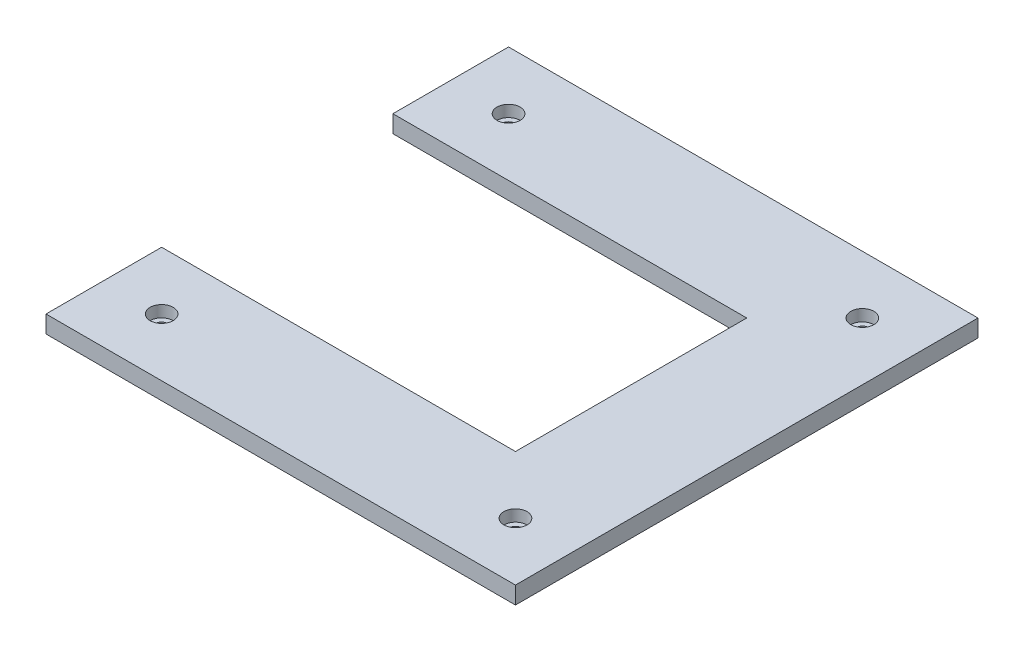
ISO-10303-21;
HEADER;
FILE_DESCRIPTION(('STEP AP214'),'2;1');
FILE_NAME('part.step','',(''),(''),'','','');
FILE_SCHEMA(('AUTOMOTIVE_DESIGN { 1 0 10303 214 1 1 1 1 }'));
ENDSEC;
DATA;
#1=APPLICATION_CONTEXT('core data for automotive mechanical design processes');
#2=APPLICATION_PROTOCOL_DEFINITION('international standard','automotive_design',2000,#1);
#3=PRODUCT_CONTEXT('',#1,'mechanical');
#4=PRODUCT('Part','Part','',(#3));
#5=PRODUCT_RELATED_PRODUCT_CATEGORY('part','',(#4));
#6=PRODUCT_DEFINITION_FORMATION('','',#4);
#7=PRODUCT_DEFINITION_CONTEXT('part definition',#1,'design');
#8=PRODUCT_DEFINITION('design','',#6,#7);
#9=PRODUCT_DEFINITION_SHAPE('','',#8);
#10=(LENGTH_UNIT() NAMED_UNIT(*) SI_UNIT(.MILLI.,.METRE.));
#11=(NAMED_UNIT(*) PLANE_ANGLE_UNIT() SI_UNIT($,.RADIAN.));
#12=(NAMED_UNIT(*) SI_UNIT($,.STERADIAN.) SOLID_ANGLE_UNIT());
#13=UNCERTAINTY_MEASURE_WITH_UNIT(LENGTH_MEASURE(1.E-05),#10,'distance_accuracy_value','');
#14=(GEOMETRIC_REPRESENTATION_CONTEXT(3) GLOBAL_UNCERTAINTY_ASSIGNED_CONTEXT((#13)) GLOBAL_UNIT_ASSIGNED_CONTEXT((#10,
#11,#12)) REPRESENTATION_CONTEXT('',''));
#15=CARTESIAN_POINT('',(0.,0.,0.));
#16=DIRECTION('',(0.,0.,1.));
#17=DIRECTION('',(1.,0.,0.));
#18=AXIS2_PLACEMENT_3D('',#15,#16,#17);
#19=CARTESIAN_POINT('',(0.,6.,0.));
#20=DIRECTION('',(0.,-1.,0.));
#21=DIRECTION('',(-1.,0.,0.));
#22=AXIS2_PLACEMENT_3D('',#19,#20,#21);
#23=PLANE('',#22);
#24=CARTESIAN_POINT('',(-142.4,6.,60.));
#25=DIRECTION('',(0.,1.,0.));
#26=DIRECTION('',(0.,0.,1.));
#27=AXIS2_PLACEMENT_3D('',#24,#25,#26);
#28=CIRCLE('',#27,4.);
#29=CARTESIAN_POINT('',(-142.4,6.,64.));
#30=VERTEX_POINT('',#29);
#31=EDGE_CURVE('E258',#30,#30,#28,.T.);
#32=ORIENTED_EDGE('',*,*,#31,.F.);
#33=EDGE_LOOP('',(#32));
#34=FACE_BOUND('',#33,.T.);
#35=CARTESIAN_POINT('',(-20.,6.,-60.));
#36=DIRECTION('',(0.,1.,0.));
#37=DIRECTION('',(0.,0.,1.));
#38=AXIS2_PLACEMENT_3D('',#35,#36,#37);
#39=CIRCLE('',#38,3.99999999999999);
#40=CARTESIAN_POINT('',(-20.,6.,-56.));
#41=VERTEX_POINT('',#40);
#42=EDGE_CURVE('E242',#41,#41,#39,.T.);
#43=ORIENTED_EDGE('',*,*,#42,.F.);
#44=EDGE_LOOP('',(#43));
#45=FACE_BOUND('',#44,.T.);
#46=DIRECTION('',(-1.,0.,0.));
#47=VECTOR('',#46,1.);
#48=CARTESIAN_POINT('',(0.,6.,40.));
#49=LINE('',#48,#47);
#50=CARTESIAN_POINT('',(-40.,6.,40.));
#51=VERTEX_POINT('',#50);
#52=CARTESIAN_POINT('',(-162.4,6.,40.));
#53=VERTEX_POINT('',#52);
#54=EDGE_CURVE('E102',#51,#53,#49,.T.);
#55=ORIENTED_EDGE('',*,*,#54,.T.);
#56=DIRECTION('',(0.,0.,-1.));
#57=VECTOR('',#56,1.);
#58=CARTESIAN_POINT('',(-162.4,6.,80.));
#59=LINE('',#58,#57);
#60=CARTESIAN_POINT('',(-162.4,6.,80.));
#61=VERTEX_POINT('',#60);
#62=EDGE_CURVE('E206',#61,#53,#59,.T.);
#63=ORIENTED_EDGE('',*,*,#62,.F.);
#64=DIRECTION('',(-1.,0.,0.));
#65=VECTOR('',#64,1.);
#66=CARTESIAN_POINT('',(0.,6.,80.));
#67=LINE('',#66,#65);
#68=CARTESIAN_POINT('',(0.,6.,80.));
#69=VERTEX_POINT('',#68);
#70=EDGE_CURVE('E194',#69,#61,#67,.T.);
#71=ORIENTED_EDGE('',*,*,#70,.F.);
#72=DIRECTION('',(0.,0.,1.));
#73=VECTOR('',#72,1.);
#74=CARTESIAN_POINT('',(0.,6.,-80.));
#75=LINE('',#74,#73);
#76=CARTESIAN_POINT('',(0.,6.,-80.));
#77=VERTEX_POINT('',#76);
#78=EDGE_CURVE('E142',#77,#69,#75,.T.);
#79=ORIENTED_EDGE('',*,*,#78,.F.);
#80=DIRECTION('',(1.,0.,0.));
#81=VECTOR('',#80,1.);
#82=CARTESIAN_POINT('',(0.,6.,-80.));
#83=LINE('',#82,#81);
#84=CARTESIAN_POINT('',(-162.4,6.,-80.));
#85=VERTEX_POINT('',#84);
#86=EDGE_CURVE('E138',#85,#77,#83,.T.);
#87=ORIENTED_EDGE('',*,*,#86,.F.);
#88=DIRECTION('',(0.,0.,-1.));
#89=VECTOR('',#88,1.);
#90=CARTESIAN_POINT('',(-162.4,6.,-40.));
#91=LINE('',#90,#89);
#92=CARTESIAN_POINT('',(-162.4,6.,-40.));
#93=VERTEX_POINT('',#92);
#94=EDGE_CURVE('E123',#93,#85,#91,.T.);
#95=ORIENTED_EDGE('',*,*,#94,.F.);
#96=DIRECTION('',(1.,0.,0.));
#97=VECTOR('',#96,1.);
#98=CARTESIAN_POINT('',(0.,6.,-40.));
#99=LINE('',#98,#97);
#100=CARTESIAN_POINT('',(-40.,6.,-40.));
#101=VERTEX_POINT('',#100);
#102=EDGE_CURVE('E130',#93,#101,#99,.T.);
#103=ORIENTED_EDGE('',*,*,#102,.T.);
#104=DIRECTION('',(0.,0.,1.));
#105=VECTOR('',#104,1.);
#106=CARTESIAN_POINT('',(-40.,6.,-80.));
#107=LINE('',#106,#105);
#108=EDGE_CURVE('E63',#101,#51,#107,.T.);
#109=ORIENTED_EDGE('',*,*,#108,.T.);
#110=EDGE_LOOP('',(#55,#63,#71,#79,#87,#95,#103,#109));
#111=FACE_BOUND('',#110,.T.);
#112=CARTESIAN_POINT('',(-20.,6.,60.));
#113=DIRECTION('',(0.,1.,0.));
#114=DIRECTION('',(0.,0.,1.));
#115=AXIS2_PLACEMENT_3D('',#112,#113,#114);
#116=CIRCLE('',#115,3.99999999999999);
#117=CARTESIAN_POINT('',(-20.,6.,64.));
#118=VERTEX_POINT('',#117);
#119=EDGE_CURVE('E226',#118,#118,#116,.T.);
#120=ORIENTED_EDGE('',*,*,#119,.F.);
#121=EDGE_LOOP('',(#120));
#122=FACE_BOUND('',#121,.T.);
#123=CARTESIAN_POINT('',(-142.4,6.,-60.));
#124=DIRECTION('',(0.,1.,0.));
#125=DIRECTION('',(0.,0.,1.));
#126=AXIS2_PLACEMENT_3D('',#123,#124,#125);
#127=CIRCLE('',#126,4.);
#128=CARTESIAN_POINT('',(-142.4,6.,-56.));
#129=VERTEX_POINT('',#128);
#130=EDGE_CURVE('E274',#129,#129,#127,.T.);
#131=ORIENTED_EDGE('',*,*,#130,.F.);
#132=EDGE_LOOP('',(#131));
#133=FACE_BOUND('',#132,.T.);
#134=ADVANCED_FACE('F45',(#34,#45,#111,#122,#133),#23,.F.);
#135=CARTESIAN_POINT('',(0.,6.,40.));
#136=DIRECTION('',(0.,0.,1.));
#137=DIRECTION('',(1.,0.,0.));
#138=AXIS2_PLACEMENT_3D('',#135,#136,#137);
#139=PLANE('',#138);
#140=DIRECTION('',(-1.,0.,0.));
#141=VECTOR('',#140,1.);
#142=CARTESIAN_POINT('',(0.,0.,40.));
#143=LINE('',#142,#141);
#144=CARTESIAN_POINT('',(-40.,0.,40.));
#145=VERTEX_POINT('',#144);
#146=CARTESIAN_POINT('',(-162.4,0.,40.));
#147=VERTEX_POINT('',#146);
#148=EDGE_CURVE('E149',#145,#147,#143,.T.);
#149=ORIENTED_EDGE('',*,*,#148,.T.);
#150=DIRECTION('',(0.,-1.,0.));
#151=VECTOR('',#150,1.);
#152=CARTESIAN_POINT('',(-162.4,6.,40.));
#153=LINE('',#152,#151);
#154=EDGE_CURVE('E11',#53,#147,#153,.T.);
#155=ORIENTED_EDGE('',*,*,#154,.F.);
#156=ORIENTED_EDGE('',*,*,#54,.F.);
#157=DIRECTION('',(0.,-1.,0.));
#158=VECTOR('',#157,1.);
#159=CARTESIAN_POINT('',(-40.,6.,40.));
#160=LINE('',#159,#158);
#161=EDGE_CURVE('E148',#51,#145,#160,.T.);
#162=ORIENTED_EDGE('',*,*,#161,.T.);
#163=EDGE_LOOP('',(#149,#155,#156,#162));
#164=FACE_BOUND('',#163,.T.);
#165=ADVANCED_FACE('F47',(#164),#139,.F.);
#166=CARTESIAN_POINT('',(-162.4,6.,80.));
#167=DIRECTION('',(-1.,0.,0.));
#168=DIRECTION('',(0.,0.,1.));
#169=AXIS2_PLACEMENT_3D('',#166,#167,#168);
#170=PLANE('',#169);
#171=DIRECTION('',(0.,0.,-1.));
#172=VECTOR('',#171,1.);
#173=CARTESIAN_POINT('',(-162.4,0.,80.));
#174=LINE('',#173,#172);
#175=CARTESIAN_POINT('',(-162.4,0.,80.));
#176=VERTEX_POINT('',#175);
#177=EDGE_CURVE('E153',#176,#147,#174,.T.);
#178=ORIENTED_EDGE('',*,*,#177,.F.);
#179=DIRECTION('',(0.,-1.,0.));
#180=VECTOR('',#179,1.);
#181=CARTESIAN_POINT('',(-162.4,6.,80.));
#182=LINE('',#181,#180);
#183=EDGE_CURVE('E55',#61,#176,#182,.T.);
#184=ORIENTED_EDGE('',*,*,#183,.F.);
#185=ORIENTED_EDGE('',*,*,#62,.T.);
#186=ORIENTED_EDGE('',*,*,#154,.T.);
#187=EDGE_LOOP('',(#178,#184,#185,#186));
#188=FACE_BOUND('',#187,.T.);
#189=ADVANCED_FACE('F197',(#188),#170,.T.);
#190=CARTESIAN_POINT('',(0.,6.,80.));
#191=DIRECTION('',(0.,0.,1.));
#192=DIRECTION('',(1.,0.,0.));
#193=AXIS2_PLACEMENT_3D('',#190,#191,#192);
#194=PLANE('',#193);
#195=DIRECTION('',(-1.,0.,0.));
#196=VECTOR('',#195,1.);
#197=CARTESIAN_POINT('',(0.,0.,80.));
#198=LINE('',#197,#196);
#199=CARTESIAN_POINT('',(0.,0.,80.));
#200=VERTEX_POINT('',#199);
#201=EDGE_CURVE('E158',#200,#176,#198,.T.);
#202=ORIENTED_EDGE('',*,*,#201,.F.);
#203=DIRECTION('',(0.,-1.,0.));
#204=VECTOR('',#203,1.);
#205=CARTESIAN_POINT('',(0.,6.,80.));
#206=LINE('',#205,#204);
#207=EDGE_CURVE('E185',#69,#200,#206,.T.);
#208=ORIENTED_EDGE('',*,*,#207,.F.);
#209=ORIENTED_EDGE('',*,*,#70,.T.);
#210=ORIENTED_EDGE('',*,*,#183,.T.);
#211=EDGE_LOOP('',(#202,#208,#209,#210));
#212=FACE_BOUND('',#211,.T.);
#213=ADVANCED_FACE('F192',(#212),#194,.T.);
#214=CARTESIAN_POINT('',(0.,6.,-80.));
#215=DIRECTION('',(1.,0.,0.));
#216=DIRECTION('',(0.,0.,-1.));
#217=AXIS2_PLACEMENT_3D('',#214,#215,#216);
#218=PLANE('',#217);
#219=DIRECTION('',(0.,0.,1.));
#220=VECTOR('',#219,1.);
#221=CARTESIAN_POINT('',(0.,0.,-80.));
#222=LINE('',#221,#220);
#223=CARTESIAN_POINT('',(0.,0.,-80.));
#224=VERTEX_POINT('',#223);
#225=EDGE_CURVE('E162',#224,#200,#222,.T.);
#226=ORIENTED_EDGE('',*,*,#225,.F.);
#227=DIRECTION('',(0.,-1.,0.));
#228=VECTOR('',#227,1.);
#229=CARTESIAN_POINT('',(0.,6.,-80.));
#230=LINE('',#229,#228);
#231=EDGE_CURVE('E182',#77,#224,#230,.T.);
#232=ORIENTED_EDGE('',*,*,#231,.F.);
#233=ORIENTED_EDGE('',*,*,#78,.T.);
#234=ORIENTED_EDGE('',*,*,#207,.T.);
#235=EDGE_LOOP('',(#226,#232,#233,#234));
#236=FACE_BOUND('',#235,.T.);
#237=ADVANCED_FACE('F204',(#236),#218,.T.);
#238=CARTESIAN_POINT('',(0.,6.,-80.));
#239=DIRECTION('',(0.,0.,-1.));
#240=DIRECTION('',(-1.,0.,0.));
#241=AXIS2_PLACEMENT_3D('',#238,#239,#240);
#242=PLANE('',#241);
#243=DIRECTION('',(1.,0.,0.));
#244=VECTOR('',#243,1.);
#245=CARTESIAN_POINT('',(0.,0.,-80.));
#246=LINE('',#245,#244);
#247=CARTESIAN_POINT('',(-162.4,0.,-80.));
#248=VERTEX_POINT('',#247);
#249=EDGE_CURVE('E166',#248,#224,#246,.T.);
#250=ORIENTED_EDGE('',*,*,#249,.F.);
#251=DIRECTION('',(0.,-1.,0.));
#252=VECTOR('',#251,1.);
#253=CARTESIAN_POINT('',(-162.4,6.,-80.));
#254=LINE('',#253,#252);
#255=EDGE_CURVE('E127',#85,#248,#254,.T.);
#256=ORIENTED_EDGE('',*,*,#255,.F.);
#257=ORIENTED_EDGE('',*,*,#86,.T.);
#258=ORIENTED_EDGE('',*,*,#231,.T.);
#259=EDGE_LOOP('',(#250,#256,#257,#258));
#260=FACE_BOUND('',#259,.T.);
#261=ADVANCED_FACE('F304',(#260),#242,.T.);
#262=CARTESIAN_POINT('',(-162.4,6.,-40.));
#263=DIRECTION('',(-1.,0.,0.));
#264=DIRECTION('',(0.,0.,1.));
#265=AXIS2_PLACEMENT_3D('',#262,#263,#264);
#266=PLANE('',#265);
#267=DIRECTION('',(0.,0.,-1.));
#268=VECTOR('',#267,1.);
#269=CARTESIAN_POINT('',(-162.4,0.,-40.));
#270=LINE('',#269,#268);
#271=CARTESIAN_POINT('',(-162.4,0.,-40.));
#272=VERTEX_POINT('',#271);
#273=EDGE_CURVE('E125',#272,#248,#270,.T.);
#274=ORIENTED_EDGE('',*,*,#273,.F.);
#275=DIRECTION('',(0.,-1.,0.));
#276=VECTOR('',#275,1.);
#277=CARTESIAN_POINT('',(-162.4,6.,-40.));
#278=LINE('',#277,#276);
#279=EDGE_CURVE('E119',#93,#272,#278,.T.);
#280=ORIENTED_EDGE('',*,*,#279,.F.);
#281=ORIENTED_EDGE('',*,*,#94,.T.);
#282=ORIENTED_EDGE('',*,*,#255,.T.);
#283=EDGE_LOOP('',(#274,#280,#281,#282));
#284=FACE_BOUND('',#283,.T.);
#285=ADVANCED_FACE('F121',(#284),#266,.T.);
#286=CARTESIAN_POINT('',(0.,6.,-40.));
#287=DIRECTION('',(0.,0.,-1.));
#288=DIRECTION('',(-1.,0.,0.));
#289=AXIS2_PLACEMENT_3D('',#286,#287,#288);
#290=PLANE('',#289);
#291=DIRECTION('',(1.,0.,0.));
#292=VECTOR('',#291,1.);
#293=CARTESIAN_POINT('',(0.,0.,-40.));
#294=LINE('',#293,#292);
#295=CARTESIAN_POINT('',(-40.,0.,-40.));
#296=VERTEX_POINT('',#295);
#297=EDGE_CURVE('E90',#272,#296,#294,.T.);
#298=ORIENTED_EDGE('',*,*,#297,.T.);
#299=DIRECTION('',(0.,-1.,0.));
#300=VECTOR('',#299,1.);
#301=CARTESIAN_POINT('',(-40.,6.,-40.));
#302=LINE('',#301,#300);
#303=EDGE_CURVE('E128',#101,#296,#302,.T.);
#304=ORIENTED_EDGE('',*,*,#303,.F.);
#305=ORIENTED_EDGE('',*,*,#102,.F.);
#306=ORIENTED_EDGE('',*,*,#279,.T.);
#307=EDGE_LOOP('',(#298,#304,#305,#306));
#308=FACE_BOUND('',#307,.T.);
#309=ADVANCED_FACE('F131',(#308),#290,.F.);
#310=CARTESIAN_POINT('',(-40.,6.,-80.));
#311=DIRECTION('',(1.,0.,0.));
#312=DIRECTION('',(0.,0.,-1.));
#313=AXIS2_PLACEMENT_3D('',#310,#311,#312);
#314=PLANE('',#313);
#315=DIRECTION('',(0.,0.,1.));
#316=VECTOR('',#315,1.);
#317=CARTESIAN_POINT('',(-40.,0.,-80.));
#318=LINE('',#317,#316);
#319=EDGE_CURVE('E96',#296,#145,#318,.T.);
#320=ORIENTED_EDGE('',*,*,#319,.T.);
#321=ORIENTED_EDGE('',*,*,#161,.F.);
#322=ORIENTED_EDGE('',*,*,#108,.F.);
#323=ORIENTED_EDGE('',*,*,#303,.T.);
#324=EDGE_LOOP('',(#320,#321,#322,#323));
#325=FACE_BOUND('',#324,.T.);
#326=ADVANCED_FACE('F297',(#325),#314,.F.);
#327=CARTESIAN_POINT('',(0.,0.,0.));
#328=DIRECTION('',(0.,-1.,0.));
#329=DIRECTION('',(-1.,0.,0.));
#330=AXIS2_PLACEMENT_3D('',#327,#328,#329);
#331=PLANE('',#330);
#332=CARTESIAN_POINT('',(-142.4,0.,-60.));
#333=DIRECTION('',(0.,-1.,0.));
#334=DIRECTION('',(0.,0.,-1.));
#335=AXIS2_PLACEMENT_3D('',#332,#333,#334);
#336=CIRCLE('',#335,2.25);
#337=CARTESIAN_POINT('',(-142.4,0.,-62.25));
#338=VERTEX_POINT('',#337);
#339=EDGE_CURVE('E262',#338,#338,#336,.T.);
#340=ORIENTED_EDGE('',*,*,#339,.F.);
#341=EDGE_LOOP('',(#340));
#342=FACE_BOUND('',#341,.T.);
#343=CARTESIAN_POINT('',(-142.4,0.,60.));
#344=DIRECTION('',(0.,-1.,0.));
#345=DIRECTION('',(0.,0.,-1.));
#346=AXIS2_PLACEMENT_3D('',#343,#344,#345);
#347=CIRCLE('',#346,2.25);
#348=CARTESIAN_POINT('',(-142.4,0.,57.75));
#349=VERTEX_POINT('',#348);
#350=EDGE_CURVE('E246',#349,#349,#347,.T.);
#351=ORIENTED_EDGE('',*,*,#350,.F.);
#352=EDGE_LOOP('',(#351));
#353=FACE_BOUND('',#352,.T.);
#354=CARTESIAN_POINT('',(-20.,0.,-60.));
#355=DIRECTION('',(0.,-1.,0.));
#356=DIRECTION('',(0.,0.,-1.));
#357=AXIS2_PLACEMENT_3D('',#354,#355,#356);
#358=CIRCLE('',#357,2.25000000000001);
#359=CARTESIAN_POINT('',(-20.,0.,-62.25));
#360=VERTEX_POINT('',#359);
#361=EDGE_CURVE('E230',#360,#360,#358,.T.);
#362=ORIENTED_EDGE('',*,*,#361,.F.);
#363=EDGE_LOOP('',(#362));
#364=FACE_BOUND('',#363,.T.);
#365=CARTESIAN_POINT('',(-20.,0.,60.));
#366=DIRECTION('',(0.,-1.,0.));
#367=DIRECTION('',(0.,0.,-1.));
#368=AXIS2_PLACEMENT_3D('',#365,#366,#367);
#369=CIRCLE('',#368,2.25000000000001);
#370=CARTESIAN_POINT('',(-20.,0.,57.75));
#371=VERTEX_POINT('',#370);
#372=EDGE_CURVE('E154',#371,#371,#369,.T.);
#373=ORIENTED_EDGE('',*,*,#372,.F.);
#374=EDGE_LOOP('',(#373));
#375=FACE_BOUND('',#374,.T.);
#376=ORIENTED_EDGE('',*,*,#148,.F.);
#377=ORIENTED_EDGE('',*,*,#319,.F.);
#378=ORIENTED_EDGE('',*,*,#297,.F.);
#379=ORIENTED_EDGE('',*,*,#273,.T.);
#380=ORIENTED_EDGE('',*,*,#249,.T.);
#381=ORIENTED_EDGE('',*,*,#225,.T.);
#382=ORIENTED_EDGE('',*,*,#201,.T.);
#383=ORIENTED_EDGE('',*,*,#177,.T.);
#384=EDGE_LOOP('',(#376,#377,#378,#379,#380,#381,#382,#383));
#385=FACE_BOUND('',#384,.T.);
#386=ADVANCED_FACE('F200',(#342,#353,#364,#375,#385),#331,.T.);
#387=CARTESIAN_POINT('',(-20.,6.,60.));
#388=DIRECTION('',(0.,1.,0.));
#389=DIRECTION('',(0.,0.,1.));
#390=AXIS2_PLACEMENT_3D('',#387,#388,#389);
#391=CYLINDRICAL_SURFACE('',#390,2.25000000000001);
#392=CARTESIAN_POINT('',(-20.,2.,60.));
#393=DIRECTION('',(0.,1.,0.));
#394=DIRECTION('',(0.,0.,1.));
#395=AXIS2_PLACEMENT_3D('',#392,#393,#394);
#396=CIRCLE('',#395,2.25000000000001);
#397=CARTESIAN_POINT('',(-20.,2.,62.25));
#398=VERTEX_POINT('',#397);
#399=EDGE_CURVE('E218',#398,#398,#396,.T.);
#400=ORIENTED_EDGE('',*,*,#399,.T.);
#401=EDGE_LOOP('',(#400));
#402=FACE_BOUND('',#401,.T.);
#403=ORIENTED_EDGE('',*,*,#372,.T.);
#404=EDGE_LOOP('',(#403));
#405=FACE_BOUND('',#404,.T.);
#406=ADVANCED_FACE('F294',(#402,#405),#391,.F.);
#407=CARTESIAN_POINT('',(-17.75,2.,60.));
#408=DIRECTION('',(0.,-1.,0.));
#409=DIRECTION('',(0.,0.,-1.));
#410=AXIS2_PLACEMENT_3D('',#407,#408,#409);
#411=PLANE('',#410);
#412=ORIENTED_EDGE('',*,*,#399,.F.);
#413=EDGE_LOOP('',(#412));
#414=FACE_BOUND('',#413,.T.);
#415=CARTESIAN_POINT('',(-20.,2.,60.));
#416=DIRECTION('',(0.,1.,0.));
#417=DIRECTION('',(0.,0.,1.));
#418=AXIS2_PLACEMENT_3D('',#415,#416,#417);
#419=CIRCLE('',#418,3.99999999999999);
#420=CARTESIAN_POINT('',(-20.,2.,64.));
#421=VERTEX_POINT('',#420);
#422=EDGE_CURVE('E222',#421,#421,#419,.T.);
#423=ORIENTED_EDGE('',*,*,#422,.T.);
#424=EDGE_LOOP('',(#423));
#425=FACE_BOUND('',#424,.T.);
#426=ADVANCED_FACE('F366',(#414,#425),#411,.F.);
#427=CARTESIAN_POINT('',(-20.,6.,60.));
#428=DIRECTION('',(0.,1.,0.));
#429=DIRECTION('',(0.,0.,1.));
#430=AXIS2_PLACEMENT_3D('',#427,#428,#429);
#431=CYLINDRICAL_SURFACE('',#430,3.99999999999999);
#432=ORIENTED_EDGE('',*,*,#422,.F.);
#433=EDGE_LOOP('',(#432));
#434=FACE_BOUND('',#433,.T.);
#435=ORIENTED_EDGE('',*,*,#119,.T.);
#436=EDGE_LOOP('',(#435));
#437=FACE_BOUND('',#436,.T.);
#438=ADVANCED_FACE('F375',(#434,#437),#431,.F.);
#439=CARTESIAN_POINT('',(-20.,6.,-60.));
#440=DIRECTION('',(0.,1.,0.));
#441=DIRECTION('',(0.,0.,1.));
#442=AXIS2_PLACEMENT_3D('',#439,#440,#441);
#443=CYLINDRICAL_SURFACE('',#442,2.25000000000001);
#444=CARTESIAN_POINT('',(-20.,2.,-60.));
#445=DIRECTION('',(0.,1.,0.));
#446=DIRECTION('',(0.,0.,1.));
#447=AXIS2_PLACEMENT_3D('',#444,#445,#446);
#448=CIRCLE('',#447,2.25000000000001);
#449=CARTESIAN_POINT('',(-20.,2.,-57.75));
#450=VERTEX_POINT('',#449);
#451=EDGE_CURVE('E234',#450,#450,#448,.T.);
#452=ORIENTED_EDGE('',*,*,#451,.T.);
#453=EDGE_LOOP('',(#452));
#454=FACE_BOUND('',#453,.T.);
#455=ORIENTED_EDGE('',*,*,#361,.T.);
#456=EDGE_LOOP('',(#455));
#457=FACE_BOUND('',#456,.T.);
#458=ADVANCED_FACE('F384',(#454,#457),#443,.F.);
#459=CARTESIAN_POINT('',(-17.75,2.,-60.));
#460=DIRECTION('',(0.,-1.,0.));
#461=DIRECTION('',(0.,0.,-1.));
#462=AXIS2_PLACEMENT_3D('',#459,#460,#461);
#463=PLANE('',#462);
#464=ORIENTED_EDGE('',*,*,#451,.F.);
#465=EDGE_LOOP('',(#464));
#466=FACE_BOUND('',#465,.T.);
#467=CARTESIAN_POINT('',(-20.,2.,-60.));
#468=DIRECTION('',(0.,1.,0.));
#469=DIRECTION('',(0.,0.,1.));
#470=AXIS2_PLACEMENT_3D('',#467,#468,#469);
#471=CIRCLE('',#470,3.99999999999999);
#472=CARTESIAN_POINT('',(-20.,2.,-56.));
#473=VERTEX_POINT('',#472);
#474=EDGE_CURVE('E238',#473,#473,#471,.T.);
#475=ORIENTED_EDGE('',*,*,#474,.T.);
#476=EDGE_LOOP('',(#475));
#477=FACE_BOUND('',#476,.T.);
#478=ADVANCED_FACE('F394',(#466,#477),#463,.F.);
#479=CARTESIAN_POINT('',(-20.,6.,-60.));
#480=DIRECTION('',(0.,1.,0.));
#481=DIRECTION('',(0.,0.,1.));
#482=AXIS2_PLACEMENT_3D('',#479,#480,#481);
#483=CYLINDRICAL_SURFACE('',#482,3.99999999999999);
#484=ORIENTED_EDGE('',*,*,#474,.F.);
#485=EDGE_LOOP('',(#484));
#486=FACE_BOUND('',#485,.T.);
#487=ORIENTED_EDGE('',*,*,#42,.T.);
#488=EDGE_LOOP('',(#487));
#489=FACE_BOUND('',#488,.T.);
#490=ADVANCED_FACE('F404',(#486,#489),#483,.F.);
#491=CARTESIAN_POINT('',(-142.4,6.,60.));
#492=DIRECTION('',(0.,1.,0.));
#493=DIRECTION('',(0.,0.,1.));
#494=AXIS2_PLACEMENT_3D('',#491,#492,#493);
#495=CYLINDRICAL_SURFACE('',#494,2.25);
#496=CARTESIAN_POINT('',(-142.4,2.,60.));
#497=DIRECTION('',(0.,1.,0.));
#498=DIRECTION('',(0.,0.,1.));
#499=AXIS2_PLACEMENT_3D('',#496,#497,#498);
#500=CIRCLE('',#499,2.25);
#501=CARTESIAN_POINT('',(-142.4,2.,62.25));
#502=VERTEX_POINT('',#501);
#503=EDGE_CURVE('E250',#502,#502,#500,.T.);
#504=ORIENTED_EDGE('',*,*,#503,.T.);
#505=EDGE_LOOP('',(#504));
#506=FACE_BOUND('',#505,.T.);
#507=ORIENTED_EDGE('',*,*,#350,.T.);
#508=EDGE_LOOP('',(#507));
#509=FACE_BOUND('',#508,.T.);
#510=ADVANCED_FACE('F414',(#506,#509),#495,.F.);
#511=CARTESIAN_POINT('',(-140.15,2.,60.));
#512=DIRECTION('',(0.,-1.,0.));
#513=DIRECTION('',(0.,0.,-1.));
#514=AXIS2_PLACEMENT_3D('',#511,#512,#513);
#515=PLANE('',#514);
#516=ORIENTED_EDGE('',*,*,#503,.F.);
#517=EDGE_LOOP('',(#516));
#518=FACE_BOUND('',#517,.T.);
#519=CARTESIAN_POINT('',(-142.4,2.,60.));
#520=DIRECTION('',(0.,1.,0.));
#521=DIRECTION('',(0.,0.,1.));
#522=AXIS2_PLACEMENT_3D('',#519,#520,#521);
#523=CIRCLE('',#522,4.);
#524=CARTESIAN_POINT('',(-142.4,2.,64.));
#525=VERTEX_POINT('',#524);
#526=EDGE_CURVE('E254',#525,#525,#523,.T.);
#527=ORIENTED_EDGE('',*,*,#526,.T.);
#528=EDGE_LOOP('',(#527));
#529=FACE_BOUND('',#528,.T.);
#530=ADVANCED_FACE('F424',(#518,#529),#515,.F.);
#531=CARTESIAN_POINT('',(-142.4,6.,60.));
#532=DIRECTION('',(0.,1.,0.));
#533=DIRECTION('',(0.,0.,1.));
#534=AXIS2_PLACEMENT_3D('',#531,#532,#533);
#535=CYLINDRICAL_SURFACE('',#534,4.);
#536=ORIENTED_EDGE('',*,*,#526,.F.);
#537=EDGE_LOOP('',(#536));
#538=FACE_BOUND('',#537,.T.);
#539=ORIENTED_EDGE('',*,*,#31,.T.);
#540=EDGE_LOOP('',(#539));
#541=FACE_BOUND('',#540,.T.);
#542=ADVANCED_FACE('F434',(#538,#541),#535,.F.);
#543=CARTESIAN_POINT('',(-142.4,6.,-60.));
#544=DIRECTION('',(0.,1.,0.));
#545=DIRECTION('',(0.,0.,1.));
#546=AXIS2_PLACEMENT_3D('',#543,#544,#545);
#547=CYLINDRICAL_SURFACE('',#546,2.25);
#548=CARTESIAN_POINT('',(-142.4,2.,-60.));
#549=DIRECTION('',(0.,1.,0.));
#550=DIRECTION('',(0.,0.,1.));
#551=AXIS2_PLACEMENT_3D('',#548,#549,#550);
#552=CIRCLE('',#551,2.25);
#553=CARTESIAN_POINT('',(-142.4,2.,-57.75));
#554=VERTEX_POINT('',#553);
#555=EDGE_CURVE('E266',#554,#554,#552,.T.);
#556=ORIENTED_EDGE('',*,*,#555,.T.);
#557=EDGE_LOOP('',(#556));
#558=FACE_BOUND('',#557,.T.);
#559=ORIENTED_EDGE('',*,*,#339,.T.);
#560=EDGE_LOOP('',(#559));
#561=FACE_BOUND('',#560,.T.);
#562=ADVANCED_FACE('F444',(#558,#561),#547,.F.);
#563=CARTESIAN_POINT('',(-140.15,2.,-60.));
#564=DIRECTION('',(0.,-1.,0.));
#565=DIRECTION('',(0.,0.,-1.));
#566=AXIS2_PLACEMENT_3D('',#563,#564,#565);
#567=PLANE('',#566);
#568=ORIENTED_EDGE('',*,*,#555,.F.);
#569=EDGE_LOOP('',(#568));
#570=FACE_BOUND('',#569,.T.);
#571=CARTESIAN_POINT('',(-142.4,2.,-60.));
#572=DIRECTION('',(0.,1.,0.));
#573=DIRECTION('',(0.,0.,1.));
#574=AXIS2_PLACEMENT_3D('',#571,#572,#573);
#575=CIRCLE('',#574,4.);
#576=CARTESIAN_POINT('',(-142.4,2.,-56.));
#577=VERTEX_POINT('',#576);
#578=EDGE_CURVE('E270',#577,#577,#575,.T.);
#579=ORIENTED_EDGE('',*,*,#578,.T.);
#580=EDGE_LOOP('',(#579));
#581=FACE_BOUND('',#580,.T.);
#582=ADVANCED_FACE('F454',(#570,#581),#567,.F.);
#583=CARTESIAN_POINT('',(-142.4,6.,-60.));
#584=DIRECTION('',(0.,1.,0.));
#585=DIRECTION('',(0.,0.,1.));
#586=AXIS2_PLACEMENT_3D('',#583,#584,#585);
#587=CYLINDRICAL_SURFACE('',#586,4.);
#588=ORIENTED_EDGE('',*,*,#578,.F.);
#589=EDGE_LOOP('',(#588));
#590=FACE_BOUND('',#589,.T.);
#591=ORIENTED_EDGE('',*,*,#130,.T.);
#592=EDGE_LOOP('',(#591));
#593=FACE_BOUND('',#592,.T.);
#594=ADVANCED_FACE('F279',(#590,#593),#587,.F.);
#595=CLOSED_SHELL('',(#134,#165,#189,#213,#237,#261,#285,#309,#326,#386,#406,#426,#438,#458,
#478,#490,#510,#530,#542,#562,#582,#594));
#596=MANIFOLD_SOLID_BREP('B2',#595);
#597=ADVANCED_BREP_SHAPE_REPRESENTATION('',(#18,#596),#14);
#598=SHAPE_DEFINITION_REPRESENTATION(#9,#597);
ENDSEC;
END-ISO-10303-21;
